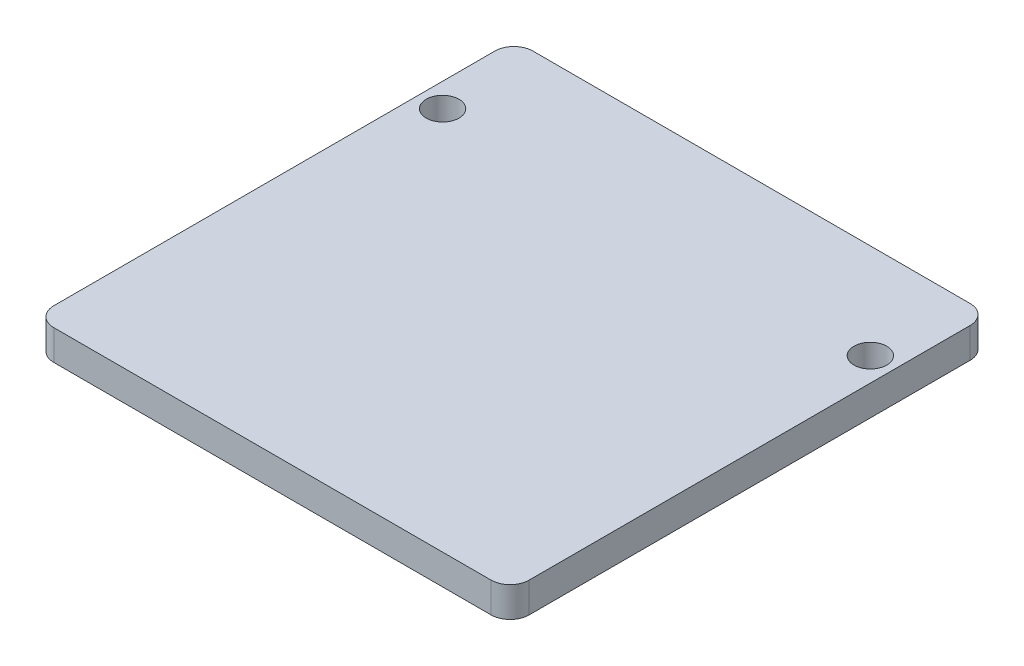
ISO-10303-21;
HEADER;
FILE_DESCRIPTION(('STEP AP214'),'2;1');
FILE_NAME('part.step','',(''),(''),'','','');
FILE_SCHEMA(('AUTOMOTIVE_DESIGN { 1 0 10303 214 1 1 1 1 }'));
ENDSEC;
DATA;
#1=APPLICATION_CONTEXT('core data for automotive mechanical design processes');
#2=APPLICATION_PROTOCOL_DEFINITION('international standard','automotive_design',2000,#1);
#3=PRODUCT_CONTEXT('',#1,'mechanical');
#4=PRODUCT('Part','Part','',(#3));
#5=PRODUCT_RELATED_PRODUCT_CATEGORY('part','',(#4));
#6=PRODUCT_DEFINITION_FORMATION('','',#4);
#7=PRODUCT_DEFINITION_CONTEXT('part definition',#1,'design');
#8=PRODUCT_DEFINITION('design','',#6,#7);
#9=PRODUCT_DEFINITION_SHAPE('','',#8);
#10=(LENGTH_UNIT() NAMED_UNIT(*) SI_UNIT(.MILLI.,.METRE.));
#11=(NAMED_UNIT(*) PLANE_ANGLE_UNIT() SI_UNIT($,.RADIAN.));
#12=(NAMED_UNIT(*) SI_UNIT($,.STERADIAN.) SOLID_ANGLE_UNIT());
#13=UNCERTAINTY_MEASURE_WITH_UNIT(LENGTH_MEASURE(1.E-05),#10,'distance_accuracy_value','');
#14=(GEOMETRIC_REPRESENTATION_CONTEXT(3) GLOBAL_UNCERTAINTY_ASSIGNED_CONTEXT((#13)) GLOBAL_UNIT_ASSIGNED_CONTEXT((#10,
#11,#12)) REPRESENTATION_CONTEXT('',''));
#15=CARTESIAN_POINT('',(0.,0.,0.));
#16=DIRECTION('',(0.,0.,1.));
#17=DIRECTION('',(1.,0.,0.));
#18=AXIS2_PLACEMENT_3D('',#15,#16,#17);
#19=CARTESIAN_POINT('',(47.5,3.175,0.));
#20=DIRECTION('',(1.,0.,0.));
#21=DIRECTION('',(0.,0.,-1.));
#22=AXIS2_PLACEMENT_3D('',#19,#20,#21);
#23=PLANE('',#22);
#24=DIRECTION('',(0.,0.,1.));
#25=VECTOR('',#24,1.);
#26=CARTESIAN_POINT('',(47.5,3.175,0.));
#27=LINE('',#26,#25);
#28=CARTESIAN_POINT('',(47.5,3.175,-8.));
#29=VERTEX_POINT('',#28);
#30=CARTESIAN_POINT('',(47.5,3.175,38.4));
#31=VERTEX_POINT('',#30);
#32=EDGE_CURVE('E190',#29,#31,#27,.T.);
#33=ORIENTED_EDGE('',*,*,#32,.T.);
#34=DIRECTION('',(0.,-1.,0.));
#35=VECTOR('',#34,1.);
#36=CARTESIAN_POINT('',(47.5,0.,38.4));
#37=LINE('',#36,#35);
#38=CARTESIAN_POINT('',(47.5,0.,38.4));
#39=VERTEX_POINT('',#38);
#40=EDGE_CURVE('E132',#31,#39,#37,.T.);
#41=ORIENTED_EDGE('',*,*,#40,.T.);
#42=DIRECTION('',(0.,0.,1.));
#43=VECTOR('',#42,1.);
#44=CARTESIAN_POINT('',(47.5,0.,0.));
#45=LINE('',#44,#43);
#46=CARTESIAN_POINT('',(47.5,0.,-8.));
#47=VERTEX_POINT('',#46);
#48=EDGE_CURVE('E116',#47,#39,#45,.T.);
#49=ORIENTED_EDGE('',*,*,#48,.F.);
#50=DIRECTION('',(0.,-1.,0.));
#51=VECTOR('',#50,1.);
#52=CARTESIAN_POINT('',(47.5,3.175,-8.));
#53=LINE('',#52,#51);
#54=EDGE_CURVE('E129',#47,#29,#53,.F.);
#55=ORIENTED_EDGE('',*,*,#54,.T.);
#56=EDGE_LOOP('',(#33,#41,#49,#55));
#57=FACE_BOUND('',#56,.T.);
#58=ADVANCED_FACE('F45',(#57),#23,.T.);
#59=CARTESIAN_POINT('',(0.,3.175,-10.));
#60=DIRECTION('',(0.,0.,-1.));
#61=DIRECTION('',(-1.,0.,0.));
#62=AXIS2_PLACEMENT_3D('',#59,#60,#61);
#63=PLANE('',#62);
#64=DIRECTION('',(1.,0.,0.));
#65=VECTOR('',#64,1.);
#66=CARTESIAN_POINT('',(0.,3.175,-10.));
#67=LINE('',#66,#65);
#68=CARTESIAN_POINT('',(-0.500000000000001,3.175,-10.));
#69=VERTEX_POINT('',#68);
#70=CARTESIAN_POINT('',(45.5,3.175,-10.));
#71=VERTEX_POINT('',#70);
#72=EDGE_CURVE('E186',#69,#71,#67,.T.);
#73=ORIENTED_EDGE('',*,*,#72,.T.);
#74=DIRECTION('',(0.,-1.,0.));
#75=VECTOR('',#74,1.);
#76=CARTESIAN_POINT('',(45.5,3.175,-10.));
#77=LINE('',#76,#75);
#78=CARTESIAN_POINT('',(45.5,0.,-10.));
#79=VERTEX_POINT('',#78);
#80=EDGE_CURVE('E11',#71,#79,#77,.T.);
#81=ORIENTED_EDGE('',*,*,#80,.T.);
#82=DIRECTION('',(1.,0.,0.));
#83=VECTOR('',#82,1.);
#84=CARTESIAN_POINT('',(0.,0.,-10.));
#85=LINE('',#84,#83);
#86=CARTESIAN_POINT('',(-0.500000000000001,0.,-10.));
#87=VERTEX_POINT('',#86);
#88=EDGE_CURVE('E118',#87,#79,#85,.T.);
#89=ORIENTED_EDGE('',*,*,#88,.F.);
#90=DIRECTION('',(0.,-1.,0.));
#91=VECTOR('',#90,1.);
#92=CARTESIAN_POINT('',(-0.500000000000001,3.175,-10.));
#93=LINE('',#92,#91);
#94=EDGE_CURVE('E54',#87,#69,#93,.F.);
#95=ORIENTED_EDGE('',*,*,#94,.T.);
#96=EDGE_LOOP('',(#73,#81,#89,#95));
#97=FACE_BOUND('',#96,.T.);
#98=ADVANCED_FACE('F185',(#97),#63,.T.);
#99=CARTESIAN_POINT('',(-2.5,3.175,0.));
#100=DIRECTION('',(1.,0.,0.));
#101=DIRECTION('',(0.,0.,-1.));
#102=AXIS2_PLACEMENT_3D('',#99,#100,#101);
#103=PLANE('',#102);
#104=DIRECTION('',(0.,0.,1.));
#105=VECTOR('',#104,1.);
#106=CARTESIAN_POINT('',(-2.5,0.,0.));
#107=LINE('',#106,#105);
#108=CARTESIAN_POINT('',(-2.5,0.,-8.));
#109=VERTEX_POINT('',#108);
#110=CARTESIAN_POINT('',(-2.5,0.,38.4));
#111=VERTEX_POINT('',#110);
#112=EDGE_CURVE('E195',#109,#111,#107,.T.);
#113=ORIENTED_EDGE('',*,*,#112,.T.);
#114=DIRECTION('',(0.,-1.,0.));
#115=VECTOR('',#114,1.);
#116=CARTESIAN_POINT('',(-2.5,3.175,38.4));
#117=LINE('',#116,#115);
#118=CARTESIAN_POINT('',(-2.5,3.175,38.4));
#119=VERTEX_POINT('',#118);
#120=EDGE_CURVE('E61',#111,#119,#117,.F.);
#121=ORIENTED_EDGE('',*,*,#120,.T.);
#122=DIRECTION('',(0.,0.,1.));
#123=VECTOR('',#122,1.);
#124=CARTESIAN_POINT('',(-2.5,3.175,0.));
#125=LINE('',#124,#123);
#126=CARTESIAN_POINT('',(-2.5,3.175,-8.));
#127=VERTEX_POINT('',#126);
#128=EDGE_CURVE('E146',#127,#119,#125,.T.);
#129=ORIENTED_EDGE('',*,*,#128,.F.);
#130=DIRECTION('',(0.,-1.,0.));
#131=VECTOR('',#130,1.);
#132=CARTESIAN_POINT('',(-2.5,0.,-8.));
#133=LINE('',#132,#131);
#134=EDGE_CURVE('E176',#127,#109,#133,.T.);
#135=ORIENTED_EDGE('',*,*,#134,.T.);
#136=EDGE_LOOP('',(#113,#121,#129,#135));
#137=FACE_BOUND('',#136,.T.);
#138=ADVANCED_FACE('F194',(#137),#103,.F.);
#139=CARTESIAN_POINT('',(0.,3.175,0.));
#140=DIRECTION('',(0.,-1.,0.));
#141=DIRECTION('',(0.,0.,-1.));
#142=AXIS2_PLACEMENT_3D('',#139,#140,#141);
#143=CYLINDRICAL_SURFACE('',#142,1.725);
#144=CARTESIAN_POINT('',(0.,3.175,0.));
#145=DIRECTION('',(0.,1.,0.));
#146=DIRECTION('',(0.,0.,1.));
#147=AXIS2_PLACEMENT_3D('',#144,#145,#146);
#148=CIRCLE('',#147,1.725);
#149=CARTESIAN_POINT('',(0.,3.175,1.725));
#150=VERTEX_POINT('',#149);
#151=EDGE_CURVE('E215',#150,#150,#148,.T.);
#152=ORIENTED_EDGE('',*,*,#151,.T.);
#153=EDGE_LOOP('',(#152));
#154=FACE_BOUND('',#153,.T.);
#155=CARTESIAN_POINT('',(0.,0.,0.));
#156=DIRECTION('',(0.,1.,0.));
#157=DIRECTION('',(0.,0.,1.));
#158=AXIS2_PLACEMENT_3D('',#155,#156,#157);
#159=CIRCLE('',#158,1.725);
#160=CARTESIAN_POINT('',(0.,0.,1.725));
#161=VERTEX_POINT('',#160);
#162=EDGE_CURVE('E134',#161,#161,#159,.T.);
#163=ORIENTED_EDGE('',*,*,#162,.F.);
#164=EDGE_LOOP('',(#163));
#165=FACE_BOUND('',#164,.T.);
#166=ADVANCED_FACE('F232',(#154,#165),#143,.F.);
#167=CARTESIAN_POINT('',(45.,3.175,0.));
#168=DIRECTION('',(0.,-1.,0.));
#169=DIRECTION('',(0.,0.,-1.));
#170=AXIS2_PLACEMENT_3D('',#167,#168,#169);
#171=CYLINDRICAL_SURFACE('',#170,1.725);
#172=CARTESIAN_POINT('',(45.,3.175,0.));
#173=DIRECTION('',(0.,1.,0.));
#174=DIRECTION('',(0.,0.,1.));
#175=AXIS2_PLACEMENT_3D('',#172,#173,#174);
#176=CIRCLE('',#175,1.725);
#177=CARTESIAN_POINT('',(45.,3.175,1.725));
#178=VERTEX_POINT('',#177);
#179=EDGE_CURVE('E201',#178,#178,#176,.T.);
#180=ORIENTED_EDGE('',*,*,#179,.T.);
#181=EDGE_LOOP('',(#180));
#182=FACE_BOUND('',#181,.T.);
#183=CARTESIAN_POINT('',(45.,0.,0.));
#184=DIRECTION('',(0.,1.,0.));
#185=DIRECTION('',(0.,0.,1.));
#186=AXIS2_PLACEMENT_3D('',#183,#184,#185);
#187=CIRCLE('',#186,1.725);
#188=CARTESIAN_POINT('',(45.,0.,1.725));
#189=VERTEX_POINT('',#188);
#190=EDGE_CURVE('E207',#189,#189,#187,.T.);
#191=ORIENTED_EDGE('',*,*,#190,.F.);
#192=EDGE_LOOP('',(#191));
#193=FACE_BOUND('',#192,.T.);
#194=ADVANCED_FACE('F223',(#182,#193),#171,.F.);
#195=CARTESIAN_POINT('',(0.,3.175,40.4));
#196=DIRECTION('',(0.,0.,-1.));
#197=DIRECTION('',(-1.,0.,0.));
#198=AXIS2_PLACEMENT_3D('',#195,#196,#197);
#199=PLANE('',#198);
#200=DIRECTION('',(1.,0.,0.));
#201=VECTOR('',#200,1.);
#202=CARTESIAN_POINT('',(0.,0.,40.4));
#203=LINE('',#202,#201);
#204=CARTESIAN_POINT('',(-0.499999999999995,0.,40.4));
#205=VERTEX_POINT('',#204);
#206=CARTESIAN_POINT('',(45.5,0.,40.4));
#207=VERTEX_POINT('',#206);
#208=EDGE_CURVE('E149',#205,#207,#203,.T.);
#209=ORIENTED_EDGE('',*,*,#208,.T.);
#210=DIRECTION('',(0.,-1.,0.));
#211=VECTOR('',#210,1.);
#212=CARTESIAN_POINT('',(45.5,3.175,40.4));
#213=LINE('',#212,#211);
#214=CARTESIAN_POINT('',(45.5,3.175,40.4));
#215=VERTEX_POINT('',#214);
#216=EDGE_CURVE('E163',#207,#215,#213,.F.);
#217=ORIENTED_EDGE('',*,*,#216,.T.);
#218=DIRECTION('',(1.,0.,0.));
#219=VECTOR('',#218,1.);
#220=CARTESIAN_POINT('',(0.,3.175,40.4));
#221=LINE('',#220,#219);
#222=CARTESIAN_POINT('',(-0.499999999999995,3.175,40.4));
#223=VERTEX_POINT('',#222);
#224=EDGE_CURVE('E140',#223,#215,#221,.T.);
#225=ORIENTED_EDGE('',*,*,#224,.F.);
#226=DIRECTION('',(0.,-1.,0.));
#227=VECTOR('',#226,1.);
#228=CARTESIAN_POINT('',(-0.499999999999995,3.175,40.4));
#229=LINE('',#228,#227);
#230=EDGE_CURVE('E159',#223,#205,#229,.T.);
#231=ORIENTED_EDGE('',*,*,#230,.T.);
#232=EDGE_LOOP('',(#209,#217,#225,#231));
#233=FACE_BOUND('',#232,.T.);
#234=ADVANCED_FACE('F228',(#233),#199,.F.);
#235=CARTESIAN_POINT('',(0.,3.175,0.));
#236=DIRECTION('',(0.,1.,0.));
#237=DIRECTION('',(0.,0.,1.));
#238=AXIS2_PLACEMENT_3D('',#235,#236,#237);
#239=PLANE('',#238);
#240=ORIENTED_EDGE('',*,*,#179,.F.);
#241=EDGE_LOOP('',(#240));
#242=FACE_BOUND('',#241,.T.);
#243=ORIENTED_EDGE('',*,*,#151,.F.);
#244=EDGE_LOOP('',(#243));
#245=FACE_BOUND('',#244,.T.);
#246=ORIENTED_EDGE('',*,*,#224,.T.);
#247=CARTESIAN_POINT('',(45.5,3.175,38.4));
#248=DIRECTION('',(0.,1.,0.));
#249=DIRECTION('',(0.,0.,1.));
#250=AXIS2_PLACEMENT_3D('',#247,#248,#249);
#251=CIRCLE('',#250,2.);
#252=EDGE_CURVE('E173',#215,#31,#251,.T.);
#253=ORIENTED_EDGE('',*,*,#252,.T.);
#254=ORIENTED_EDGE('',*,*,#32,.F.);
#255=CARTESIAN_POINT('',(45.5,3.175,-8.));
#256=DIRECTION('',(0.,1.,0.));
#257=DIRECTION('',(0.,0.,1.));
#258=AXIS2_PLACEMENT_3D('',#255,#256,#257);
#259=CIRCLE('',#258,2.);
#260=EDGE_CURVE('E138',#29,#71,#259,.T.);
#261=ORIENTED_EDGE('',*,*,#260,.T.);
#262=ORIENTED_EDGE('',*,*,#72,.F.);
#263=CARTESIAN_POINT('',(-0.500000000000001,3.175,-8.));
#264=DIRECTION('',(0.,1.,0.));
#265=DIRECTION('',(0.,0.,1.));
#266=AXIS2_PLACEMENT_3D('',#263,#264,#265);
#267=CIRCLE('',#266,2.);
#268=EDGE_CURVE('E68',#69,#127,#267,.T.);
#269=ORIENTED_EDGE('',*,*,#268,.T.);
#270=ORIENTED_EDGE('',*,*,#128,.T.);
#271=CARTESIAN_POINT('',(-0.499999999999995,3.175,38.4));
#272=DIRECTION('',(0.,1.,0.));
#273=DIRECTION('',(0.,0.,1.));
#274=AXIS2_PLACEMENT_3D('',#271,#272,#273);
#275=CIRCLE('',#274,2.);
#276=EDGE_CURVE('E170',#119,#223,#275,.T.);
#277=ORIENTED_EDGE('',*,*,#276,.T.);
#278=EDGE_LOOP('',(#246,#253,#254,#261,#262,#269,#270,#277));
#279=FACE_BOUND('',#278,.T.);
#280=ADVANCED_FACE('F188',(#242,#245,#279),#239,.T.);
#281=CARTESIAN_POINT('',(0.,0.,0.));
#282=DIRECTION('',(0.,1.,0.));
#283=DIRECTION('',(0.,0.,1.));
#284=AXIS2_PLACEMENT_3D('',#281,#282,#283);
#285=PLANE('',#284);
#286=ORIENTED_EDGE('',*,*,#190,.T.);
#287=EDGE_LOOP('',(#286));
#288=FACE_BOUND('',#287,.T.);
#289=ORIENTED_EDGE('',*,*,#162,.T.);
#290=EDGE_LOOP('',(#289));
#291=FACE_BOUND('',#290,.T.);
#292=ORIENTED_EDGE('',*,*,#48,.T.);
#293=CARTESIAN_POINT('',(45.5,0.,38.4));
#294=DIRECTION('',(0.,1.,0.));
#295=DIRECTION('',(0.,0.,1.));
#296=AXIS2_PLACEMENT_3D('',#293,#294,#295);
#297=CIRCLE('',#296,2.);
#298=EDGE_CURVE('E156',#39,#207,#297,.F.);
#299=ORIENTED_EDGE('',*,*,#298,.T.);
#300=ORIENTED_EDGE('',*,*,#208,.F.);
#301=CARTESIAN_POINT('',(-0.499999999999995,0.,38.4));
#302=DIRECTION('',(0.,1.,0.));
#303=DIRECTION('',(0.,0.,1.));
#304=AXIS2_PLACEMENT_3D('',#301,#302,#303);
#305=CIRCLE('',#304,2.);
#306=EDGE_CURVE('E123',#205,#111,#305,.F.);
#307=ORIENTED_EDGE('',*,*,#306,.T.);
#308=ORIENTED_EDGE('',*,*,#112,.F.);
#309=CARTESIAN_POINT('',(-0.500000000000001,0.,-8.));
#310=DIRECTION('',(0.,1.,0.));
#311=DIRECTION('',(0.,0.,1.));
#312=AXIS2_PLACEMENT_3D('',#309,#310,#311);
#313=CIRCLE('',#312,2.);
#314=EDGE_CURVE('E124',#109,#87,#313,.F.);
#315=ORIENTED_EDGE('',*,*,#314,.T.);
#316=ORIENTED_EDGE('',*,*,#88,.T.);
#317=CARTESIAN_POINT('',(45.5,0.,-8.));
#318=DIRECTION('',(0.,1.,0.));
#319=DIRECTION('',(0.,0.,1.));
#320=AXIS2_PLACEMENT_3D('',#317,#318,#319);
#321=CIRCLE('',#320,2.);
#322=EDGE_CURVE('E113',#79,#47,#321,.F.);
#323=ORIENTED_EDGE('',*,*,#322,.T.);
#324=EDGE_LOOP('',(#292,#299,#300,#307,#308,#315,#316,#323));
#325=FACE_BOUND('',#324,.T.);
#326=ADVANCED_FACE('F115',(#288,#291,#325),#285,.F.);
#327=CARTESIAN_POINT('',(45.5,3.175,38.4));
#328=DIRECTION('',(0.,1.,0.));
#329=DIRECTION('',(0.,0.,1.));
#330=AXIS2_PLACEMENT_3D('',#327,#328,#329);
#331=CYLINDRICAL_SURFACE('',#330,2.);
#332=ORIENTED_EDGE('',*,*,#252,.F.);
#333=ORIENTED_EDGE('',*,*,#216,.F.);
#334=ORIENTED_EDGE('',*,*,#298,.F.);
#335=ORIENTED_EDGE('',*,*,#40,.F.);
#336=EDGE_LOOP('',(#332,#333,#334,#335));
#337=FACE_BOUND('',#336,.T.);
#338=ADVANCED_FACE('F239',(#337),#331,.T.);
#339=CARTESIAN_POINT('',(-0.499999999999995,3.175,38.4));
#340=DIRECTION('',(0.,-1.,0.));
#341=DIRECTION('',(0.,0.,-1.));
#342=AXIS2_PLACEMENT_3D('',#339,#340,#341);
#343=CYLINDRICAL_SURFACE('',#342,2.);
#344=ORIENTED_EDGE('',*,*,#276,.F.);
#345=ORIENTED_EDGE('',*,*,#120,.F.);
#346=ORIENTED_EDGE('',*,*,#306,.F.);
#347=ORIENTED_EDGE('',*,*,#230,.F.);
#348=EDGE_LOOP('',(#344,#345,#346,#347));
#349=FACE_BOUND('',#348,.T.);
#350=ADVANCED_FACE('F245',(#349),#343,.T.);
#351=CARTESIAN_POINT('',(45.5,3.175,-8.));
#352=DIRECTION('',(0.,-1.,0.));
#353=DIRECTION('',(0.,0.,-1.));
#354=AXIS2_PLACEMENT_3D('',#351,#352,#353);
#355=CYLINDRICAL_SURFACE('',#354,2.);
#356=ORIENTED_EDGE('',*,*,#260,.F.);
#357=ORIENTED_EDGE('',*,*,#54,.F.);
#358=ORIENTED_EDGE('',*,*,#322,.F.);
#359=ORIENTED_EDGE('',*,*,#80,.F.);
#360=EDGE_LOOP('',(#356,#357,#358,#359));
#361=FACE_BOUND('',#360,.T.);
#362=ADVANCED_FACE('F137',(#361),#355,.T.);
#363=CARTESIAN_POINT('',(-0.500000000000001,3.175,-8.));
#364=DIRECTION('',(0.,1.,0.));
#365=DIRECTION('',(0.,0.,1.));
#366=AXIS2_PLACEMENT_3D('',#363,#364,#365);
#367=CYLINDRICAL_SURFACE('',#366,2.);
#368=ORIENTED_EDGE('',*,*,#268,.F.);
#369=ORIENTED_EDGE('',*,*,#94,.F.);
#370=ORIENTED_EDGE('',*,*,#314,.F.);
#371=ORIENTED_EDGE('',*,*,#134,.F.);
#372=EDGE_LOOP('',(#368,#369,#370,#371));
#373=FACE_BOUND('',#372,.T.);
#374=ADVANCED_FACE('F47',(#373),#367,.T.);
#375=CLOSED_SHELL('',(#58,#98,#138,#166,#194,#234,#280,#326,#338,#350,#362,#374));
#376=MANIFOLD_SOLID_BREP('B2',#375);
#377=ADVANCED_BREP_SHAPE_REPRESENTATION('',(#18,#376),#14);
#378=SHAPE_DEFINITION_REPRESENTATION(#9,#377);
ENDSEC;
END-ISO-10303-21;
